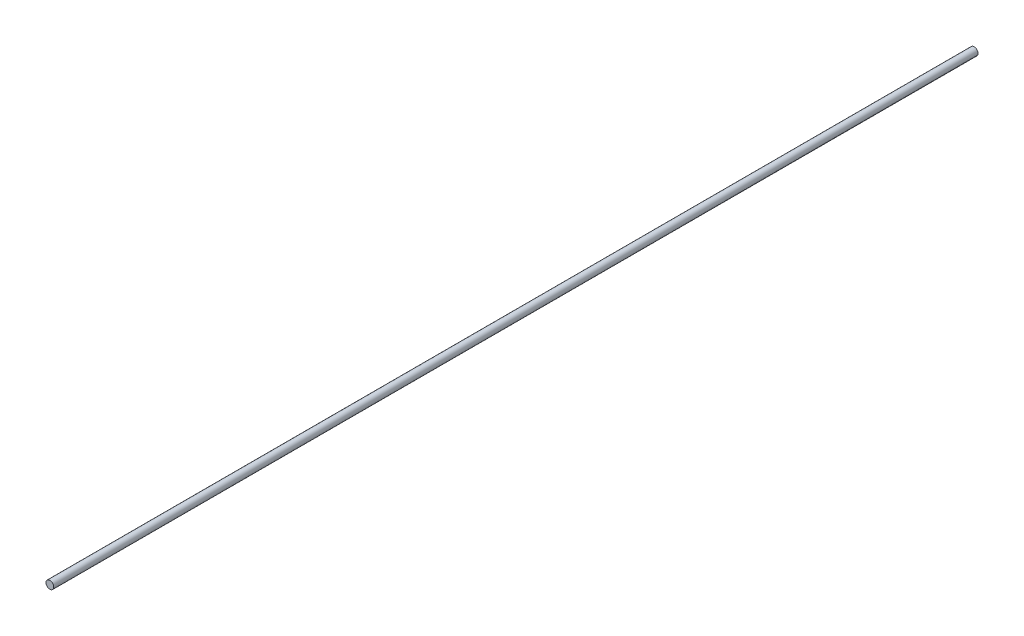
ISO-10303-21;
HEADER;
FILE_DESCRIPTION(('STEP AP214'),'2;1');
FILE_NAME('part.step','',(''),(''),'','','');
FILE_SCHEMA(('AUTOMOTIVE_DESIGN { 1 0 10303 214 1 1 1 1 }'));
ENDSEC;
DATA;
#1=APPLICATION_CONTEXT('core data for automotive mechanical design processes');
#2=APPLICATION_PROTOCOL_DEFINITION('international standard','automotive_design',2000,#1);
#3=PRODUCT_CONTEXT('',#1,'mechanical');
#4=PRODUCT('Part','Part','',(#3));
#5=PRODUCT_RELATED_PRODUCT_CATEGORY('part','',(#4));
#6=PRODUCT_DEFINITION_FORMATION('','',#4);
#7=PRODUCT_DEFINITION_CONTEXT('part definition',#1,'design');
#8=PRODUCT_DEFINITION('design','',#6,#7);
#9=PRODUCT_DEFINITION_SHAPE('','',#8);
#10=(LENGTH_UNIT() NAMED_UNIT(*) SI_UNIT(.MILLI.,.METRE.));
#11=(NAMED_UNIT(*) PLANE_ANGLE_UNIT() SI_UNIT($,.RADIAN.));
#12=(NAMED_UNIT(*) SI_UNIT($,.STERADIAN.) SOLID_ANGLE_UNIT());
#13=UNCERTAINTY_MEASURE_WITH_UNIT(LENGTH_MEASURE(1.E-05),#10,'distance_accuracy_value','');
#14=(GEOMETRIC_REPRESENTATION_CONTEXT(3) GLOBAL_UNCERTAINTY_ASSIGNED_CONTEXT((#13)) GLOBAL_UNIT_ASSIGNED_CONTEXT((#10,
#11,#12)) REPRESENTATION_CONTEXT('',''));
#15=CARTESIAN_POINT('',(0.,0.,0.));
#16=DIRECTION('',(0.,0.,1.));
#17=DIRECTION('',(1.,0.,0.));
#18=AXIS2_PLACEMENT_3D('',#15,#16,#17);
#19=CARTESIAN_POINT('',(0.,0.,715.));
#20=DIRECTION('',(0.,0.,-1.));
#21=DIRECTION('',(-1.,0.,0.));
#22=AXIS2_PLACEMENT_3D('',#19,#20,#21);
#23=CYLINDRICAL_SURFACE('',#22,3.);
#24=CARTESIAN_POINT('',(0.,0.,715.));
#25=DIRECTION('',(0.,0.,1.));
#26=DIRECTION('',(1.,0.,0.));
#27=AXIS2_PLACEMENT_3D('',#24,#25,#26);
#28=CIRCLE('',#27,3.);
#29=CARTESIAN_POINT('',(3.,0.,715.));
#30=VERTEX_POINT('',#29);
#31=EDGE_CURVE('E10',#30,#30,#28,.T.);
#32=ORIENTED_EDGE('',*,*,#31,.F.);
#33=EDGE_LOOP('',(#32));
#34=FACE_BOUND('',#33,.T.);
#35=CARTESIAN_POINT('',(0.,0.,0.));
#36=DIRECTION('',(0.,0.,1.));
#37=DIRECTION('',(1.,0.,0.));
#38=AXIS2_PLACEMENT_3D('',#35,#36,#37);
#39=CIRCLE('',#38,3.);
#40=CARTESIAN_POINT('',(3.,0.,0.));
#41=VERTEX_POINT('',#40);
#42=EDGE_CURVE('E33',#41,#41,#39,.T.);
#43=ORIENTED_EDGE('',*,*,#42,.T.);
#44=EDGE_LOOP('',(#43));
#45=FACE_BOUND('',#44,.T.);
#46=ADVANCED_FACE('F30',(#34,#45),#23,.T.);
#47=CARTESIAN_POINT('',(0.,0.,715.));
#48=DIRECTION('',(0.,0.,1.));
#49=DIRECTION('',(1.,0.,0.));
#50=AXIS2_PLACEMENT_3D('',#47,#48,#49);
#51=PLANE('',#50);
#52=ORIENTED_EDGE('',*,*,#31,.T.);
#53=EDGE_LOOP('',(#52));
#54=FACE_BOUND('',#53,.T.);
#55=ADVANCED_FACE('F45',(#54),#51,.T.);
#56=CARTESIAN_POINT('',(0.,0.,0.));
#57=DIRECTION('',(0.,0.,1.));
#58=DIRECTION('',(1.,0.,0.));
#59=AXIS2_PLACEMENT_3D('',#56,#57,#58);
#60=PLANE('',#59);
#61=ORIENTED_EDGE('',*,*,#42,.F.);
#62=EDGE_LOOP('',(#61));
#63=FACE_BOUND('',#62,.T.);
#64=ADVANCED_FACE('F43',(#63),#60,.F.);
#65=CLOSED_SHELL('',(#46,#55,#64));
#66=MANIFOLD_SOLID_BREP('B2',#65);
#67=ADVANCED_BREP_SHAPE_REPRESENTATION('',(#18,#66),#14);
#68=SHAPE_DEFINITION_REPRESENTATION(#9,#67);
ENDSEC;
END-ISO-10303-21;
